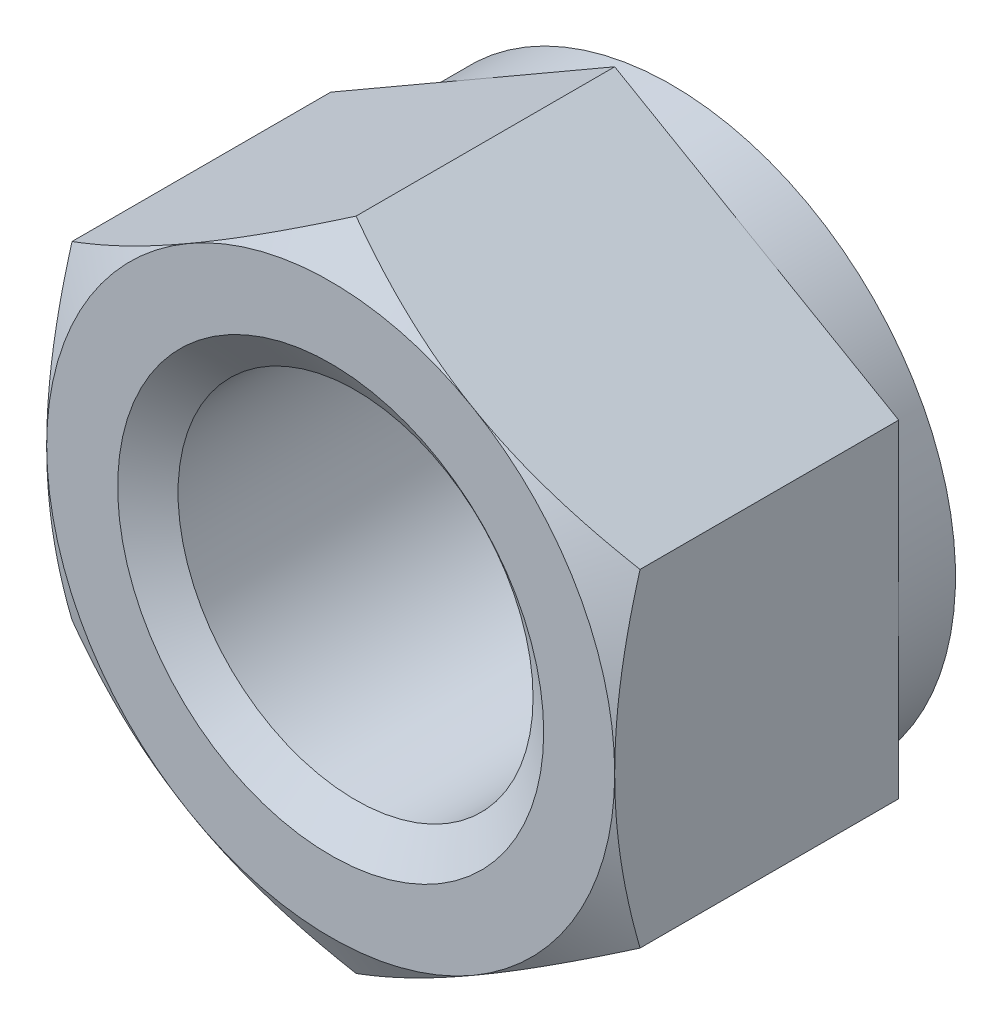
ISO-10303-21;
HEADER;
FILE_DESCRIPTION(('STEP AP214'),'2;1');
FILE_NAME('part.step','',(''),(''),'','','');
FILE_SCHEMA(('AUTOMOTIVE_DESIGN { 1 0 10303 214 1 1 1 1 }'));
ENDSEC;
DATA;
#1=APPLICATION_CONTEXT('core data for automotive mechanical design processes');
#2=APPLICATION_PROTOCOL_DEFINITION('international standard','automotive_design',2000,#1);
#3=PRODUCT_CONTEXT('',#1,'mechanical');
#4=PRODUCT('Part','Part','',(#3));
#5=PRODUCT_RELATED_PRODUCT_CATEGORY('part','',(#4));
#6=PRODUCT_DEFINITION_FORMATION('','',#4);
#7=PRODUCT_DEFINITION_CONTEXT('part definition',#1,'design');
#8=PRODUCT_DEFINITION('design','',#6,#7);
#9=PRODUCT_DEFINITION_SHAPE('','',#8);
#10=(LENGTH_UNIT() NAMED_UNIT(*) SI_UNIT(.MILLI.,.METRE.));
#11=(NAMED_UNIT(*) PLANE_ANGLE_UNIT() SI_UNIT($,.RADIAN.));
#12=(NAMED_UNIT(*) SI_UNIT($,.STERADIAN.) SOLID_ANGLE_UNIT());
#13=UNCERTAINTY_MEASURE_WITH_UNIT(LENGTH_MEASURE(1.E-05),#10,'distance_accuracy_value','');
#14=(GEOMETRIC_REPRESENTATION_CONTEXT(3) GLOBAL_UNCERTAINTY_ASSIGNED_CONTEXT((#13)) GLOBAL_UNIT_ASSIGNED_CONTEXT((#10,
#11,#12)) REPRESENTATION_CONTEXT('',''));
#15=CARTESIAN_POINT('',(0.,0.,0.));
#16=DIRECTION('',(0.,0.,1.));
#17=DIRECTION('',(1.,0.,0.));
#18=AXIS2_PLACEMENT_3D('',#15,#16,#17);
#19=CARTESIAN_POINT('',(0.,0.,-2.4));
#20=DIRECTION('',(0.,0.,1.));
#21=DIRECTION('',(1.,0.,0.));
#22=AXIS2_PLACEMENT_3D('',#19,#20,#21);
#23=CYLINDRICAL_SURFACE('',#22,1.25);
#24=CARTESIAN_POINT('',(0.,0.,-0.17505188455243));
#25=DIRECTION('',(0.,0.,1.));
#26=DIRECTION('',(1.,0.,0.));
#27=AXIS2_PLACEMENT_3D('',#24,#25,#26);
#28=CIRCLE('',#27,1.25);
#29=CARTESIAN_POINT('',(1.25,0.,-0.17505188455243));
#30=VERTEX_POINT('',#29);
#31=EDGE_CURVE('E153',#30,#30,#28,.F.);
#32=ORIENTED_EDGE('',*,*,#31,.F.);
#33=EDGE_LOOP('',(#32));
#34=FACE_BOUND('',#33,.T.);
#35=CARTESIAN_POINT('',(0.,0.,-2.19954811544757));
#36=DIRECTION('',(0.,0.,-1.));
#37=DIRECTION('',(-1.,0.,0.));
#38=AXIS2_PLACEMENT_3D('',#35,#36,#37);
#39=CIRCLE('',#38,1.25);
#40=CARTESIAN_POINT('',(-1.25,0.,-2.19954811544757));
#41=VERTEX_POINT('',#40);
#42=EDGE_CURVE('E41',#41,#41,#39,.F.);
#43=ORIENTED_EDGE('',*,*,#42,.F.);
#44=EDGE_LOOP('',(#43));
#45=FACE_BOUND('',#44,.T.);
#46=ADVANCED_FACE('F36',(#34,#45),#23,.F.);
#47=CARTESIAN_POINT('',(0.,2.30940107675851,-2.4));
#48=DIRECTION('',(-0.500000000000001,0.866025403784438,0.));
#49=DIRECTION('',(-0.866025403784438,-0.500000000000001,0.));
#50=AXIS2_PLACEMENT_3D('',#47,#48,#49);
#51=PLANE('',#50);
#52=DIRECTION('',(0.,0.,1.));
#53=VECTOR('',#52,1.);
#54=CARTESIAN_POINT('',(-2.,1.15470053837925,-2.4));
#55=LINE('',#54,#53);
#56=CARTESIAN_POINT('',(-2.,1.15470053837925,-2.));
#57=VERTEX_POINT('',#56);
#58=CARTESIAN_POINT('',(-2.,1.15470053837925,-0.178632794954083));
#59=VERTEX_POINT('',#58);
#60=EDGE_CURVE('E288',#57,#59,#55,.T.);
#61=ORIENTED_EDGE('',*,*,#60,.T.);
#62=CARTESIAN_POINT('',(-2.0002,1.15458506832541,-0.178699466620498));
#63=CARTESIAN_POINT('',(-1.91230873709994,1.20532911262018,-0.149389536100679));
#64=CARTESIAN_POINT('',(-1.82365880552641,1.2565111744778,-0.122732851980467));
#65=CARTESIAN_POINT('',(-1.6448237530022,1.35976164019319,-0.0762024910207215));
#66=CARTESIAN_POINT('',(-1.55463545349496,1.41183187919145,-0.0563452763827796));
#67=CARTESIAN_POINT('',(-1.37537661423669,1.51532701829183,-0.025433464023253));
#68=CARTESIAN_POINT('',(-1.2863336617737,1.56673599086578,-0.0141731515985316));
#69=CARTESIAN_POINT('',(-1.10782860221496,1.66979593505373,-0.00072866259464233));
#70=CARTESIAN_POINT('',(-1.01836714429604,1.72144653186531,0.00146664504653134));
#71=CARTESIAN_POINT('',(-0.851191646451202,1.81796535054794,-0.00309098933064944));
#72=CARTESIAN_POINT('',(-0.773452629734216,1.86284799277603,-0.00872487468701537));
#73=CARTESIAN_POINT('',(-0.618481085463867,1.95232085557725,-0.0265838952608293));
#74=CARTESIAN_POINT('',(-0.541249094258801,1.99691076648954,-0.0388151360234404));
#75=CARTESIAN_POINT('',(-0.385957813517799,2.08656822922816,-0.069393436867611));
#76=CARTESIAN_POINT('',(-0.30791818689262,2.13162442866767,-0.0878701670657172));
#77=CARTESIAN_POINT('',(-0.153003134307865,2.221064675979,-0.129805518212858));
#78=CARTESIAN_POINT('',(-0.0761257223768793,2.26544987045196,-0.153254280492316));
#79=CARTESIAN_POINT('',(0.000200000000000656,2.30951654681234,-0.1786994666205));
#80=B_SPLINE_CURVE_WITH_KNOTS('',3,(#62,#63,#64,#65,#66,#67,#68,#69,#70,#71,#72,#73,#74,#75,#76,
#77,#78,#79),.UNSPECIFIED.,.F.,.F.,(4,2,2,2,2,2,2,2,4),(0.,0.31703182469561,0.634825876346564,
0.944753967652636,1.25430138000371,1.52387047293094,1.79368946861028,2.06949491027634,
2.34475850821473),.UNSPECIFIED.);
#81=CARTESIAN_POINT('',(-1.,1.73205080756888,0.));
#82=VERTEX_POINT('',#81);
#83=EDGE_CURVE('E60',#59,#82,#80,.T.);
#84=ORIENTED_EDGE('',*,*,#83,.T.);
#85=CARTESIAN_POINT('',(0.,2.30940107675851,-0.178632794954083));
#86=VERTEX_POINT('',#85);
#87=EDGE_CURVE('E167',#82,#86,#80,.T.);
#88=ORIENTED_EDGE('',*,*,#87,.T.);
#89=DIRECTION('',(0.,0.,1.));
#90=VECTOR('',#89,1.);
#91=CARTESIAN_POINT('',(0.,2.30940107675851,-2.4));
#92=LINE('',#91,#90);
#93=CARTESIAN_POINT('',(0.,2.30940107675851,-2.));
#94=VERTEX_POINT('',#93);
#95=EDGE_CURVE('E276',#94,#86,#92,.T.);
#96=ORIENTED_EDGE('',*,*,#95,.F.);
#97=DIRECTION('',(-0.866025403784438,-0.500000000000001,0.));
#98=VECTOR('',#97,1.);
#99=CARTESIAN_POINT('',(0.,2.30940107675851,-2.));
#100=LINE('',#99,#98);
#101=CARTESIAN_POINT('',(-1.,1.73205080756888,-2.));
#102=VERTEX_POINT('',#101);
#103=EDGE_CURVE('E264',#94,#102,#100,.T.);
#104=ORIENTED_EDGE('',*,*,#103,.T.);
#105=EDGE_CURVE('E260',#102,#57,#100,.T.);
#106=ORIENTED_EDGE('',*,*,#105,.T.);
#107=EDGE_LOOP('',(#61,#84,#88,#96,#104,#106));
#108=FACE_BOUND('',#107,.T.);
#109=ADVANCED_FACE('F38',(#108),#51,.T.);
#110=CARTESIAN_POINT('',(2.,1.15470053837925,-2.4));
#111=DIRECTION('',(0.500000000000002,0.866025403784437,0.));
#112=DIRECTION('',(-0.866025403784438,0.500000000000002,0.));
#113=AXIS2_PLACEMENT_3D('',#110,#111,#112);
#114=PLANE('',#113);
#115=ORIENTED_EDGE('',*,*,#95,.T.);
#116=CARTESIAN_POINT('',(-0.000199999999999259,2.30951654681234,-0.1786994666205));
#117=CARTESIAN_POINT('',(0.0876912629000607,2.25877250251758,-0.149389536100681));
#118=CARTESIAN_POINT('',(0.176341194473592,2.20759044065996,-0.122732851980469));
#119=CARTESIAN_POINT('',(0.355176246997803,2.10433997494456,-0.0762024910207225));
#120=CARTESIAN_POINT('',(0.445364546505037,2.05226973594631,-0.0563452763827804));
#121=CARTESIAN_POINT('',(0.624623385763307,1.94877459684592,-0.0254334640232533));
#122=CARTESIAN_POINT('',(0.713666338226305,1.89736562427197,-0.0141731515985317));
#123=CARTESIAN_POINT('',(0.892171397785044,1.79430568008402,-0.000728662594642108));
#124=CARTESIAN_POINT('',(0.981632855703959,1.74265508327244,0.00146664504653167));
#125=CARTESIAN_POINT('',(1.1488083535488,1.64613626458981,-0.00309098933064885));
#126=CARTESIAN_POINT('',(1.22654737026578,1.60125362236172,-0.00872487468701462));
#127=CARTESIAN_POINT('',(1.38151891453613,1.51178075956051,-0.0265838952608285));
#128=CARTESIAN_POINT('',(1.4587509057412,1.46719084864821,-0.0388151360234395));
#129=CARTESIAN_POINT('',(1.6140421864822,1.37753338590959,-0.0693934368676101));
#130=CARTESIAN_POINT('',(1.69208181310738,1.33247718647009,-0.0878701670657161));
#131=CARTESIAN_POINT('',(1.84699686569214,1.24303693915875,-0.129805518212856));
#132=CARTESIAN_POINT('',(1.92387427762312,1.19865174468579,-0.153254280492314));
#133=CARTESIAN_POINT('',(2.0002,1.15458506832541,-0.178699466620498));
#134=B_SPLINE_CURVE_WITH_KNOTS('',3,(#116,#117,#118,#119,#120,#121,#122,#123,#124,#125,#126,
#127,#128,#129,#130,#131,#132,#133),.UNSPECIFIED.,.F.,.F.,(4,2,2,2,2,2,2,2,4),(0.,
0.31703182469561,0.634825876346565,0.944753967652638,1.25430138000371,1.52387047293094,
1.79368946861029,2.06949491027634,2.34475850821473),.UNSPECIFIED.);
#135=CARTESIAN_POINT('',(1.,1.73205080756888,0.));
#136=VERTEX_POINT('',#135);
#137=EDGE_CURVE('E164',#86,#136,#134,.T.);
#138=ORIENTED_EDGE('',*,*,#137,.T.);
#139=CARTESIAN_POINT('',(2.,1.15470053837926,-0.178632794954083));
#140=VERTEX_POINT('',#139);
#141=EDGE_CURVE('E147',#136,#140,#134,.T.);
#142=ORIENTED_EDGE('',*,*,#141,.T.);
#143=DIRECTION('',(0.,0.,1.));
#144=VECTOR('',#143,1.);
#145=CARTESIAN_POINT('',(2.,1.15470053837925,-2.4));
#146=LINE('',#145,#144);
#147=CARTESIAN_POINT('',(2.,1.15470053837925,-2.));
#148=VERTEX_POINT('',#147);
#149=EDGE_CURVE('E163',#148,#140,#146,.T.);
#150=ORIENTED_EDGE('',*,*,#149,.F.);
#151=DIRECTION('',(-0.866025403784438,0.500000000000002,0.));
#152=VECTOR('',#151,1.);
#153=CARTESIAN_POINT('',(2.,1.15470053837925,-2.));
#154=LINE('',#153,#152);
#155=CARTESIAN_POINT('',(1.,1.73205080756888,-2.));
#156=VERTEX_POINT('',#155);
#157=EDGE_CURVE('E272',#148,#156,#154,.T.);
#158=ORIENTED_EDGE('',*,*,#157,.T.);
#159=EDGE_CURVE('E268',#156,#94,#154,.T.);
#160=ORIENTED_EDGE('',*,*,#159,.T.);
#161=EDGE_LOOP('',(#115,#138,#142,#150,#158,#160));
#162=FACE_BOUND('',#161,.T.);
#163=ADVANCED_FACE('F236',(#162),#114,.T.);
#164=CARTESIAN_POINT('',(2.,1.15470053837925,-2.4));
#165=DIRECTION('',(-1.,0.,0.));
#166=DIRECTION('',(0.,0.,1.));
#167=AXIS2_PLACEMENT_3D('',#164,#165,#166);
#168=PLANE('',#167);
#169=CARTESIAN_POINT('',(2.,-3.06243599497946,-0.957053410620321));
#170=CARTESIAN_POINT('',(2.,-2.97462468513202,-0.914618135332452));
#171=CARTESIAN_POINT('',(2.,-2.88660576044575,-0.872604701878199));
#172=CARTESIAN_POINT('',(2.,-2.71004042392047,-0.789662573424089));
#173=CARTESIAN_POINT('',(2.,-2.62149392396103,-0.748734066234633));
#174=CARTESIAN_POINT('',(2.,-2.44328285836994,-0.667987231477972));
#175=CARTESIAN_POINT('',(2.,-2.3536147942302,-0.628176597351501));
#176=CARTESIAN_POINT('',(2.,-2.17354167395292,-0.55026529289016));
#177=CARTESIAN_POINT('',(2.,-2.08313665652235,-0.512164533422732));
#178=CARTESIAN_POINT('',(2.,-1.90031404940485,-0.437671460362099));
#179=CARTESIAN_POINT('',(2.,-1.80788540023434,-0.401306140224328));
#180=CARTESIAN_POINT('',(2.,-1.62195694964761,-0.331431205515075));
#181=CARTESIAN_POINT('',(2.,-1.52845725096658,-0.297921319609402));
#182=CARTESIAN_POINT('',(2.,-1.34040158791134,-0.234645877627144));
#183=CARTESIAN_POINT('',(2.,-1.24584820361334,-0.204872731943686));
#184=CARTESIAN_POINT('',(2.,-1.05539728812543,-0.150041663725098));
#185=CARTESIAN_POINT('',(2.,-0.959500192348565,-0.124982250068513));
#186=CARTESIAN_POINT('',(2.,-0.766296107056177,-0.080795452261452));
#187=CARTESIAN_POINT('',(2.,-0.668988749343054,-0.0616696475902395));
#188=CARTESIAN_POINT('',(2.,-0.473201573751662,-0.030636913349022));
#189=CARTESIAN_POINT('',(2.,-0.374721754836868,-0.0187299901614156));
#190=CARTESIAN_POINT('',(2.,-0.177725213014459,-0.00319166535968532));
#191=CARTESIAN_POINT('',(2.,-0.0792127464695961,0.000492126942978395));
#192=CARTESIAN_POINT('',(2.,0.117733134481543,-0.00059921048284586));
#193=CARTESIAN_POINT('',(2.,0.216166562771042,-0.00537214444611043));
#194=CARTESIAN_POINT('',(2.,0.454297223248123,-0.0267243139120266));
#195=CARTESIAN_POINT('',(2.,0.593620477818537,-0.0474829418890643));
#196=CARTESIAN_POINT('',(2.,0.869689306254771,-0.102199494270679));
#197=CARTESIAN_POINT('',(2.,1.00643164818022,-0.136172948124203));
#198=CARTESIAN_POINT('',(2.,1.21108706615394,-0.194758945655361));
#199=CARTESIAN_POINT('',(2.,1.28004655189501,-0.215857177032566));
#200=CARTESIAN_POINT('',(2.,1.41724192464572,-0.260142084128328));
#201=CARTESIAN_POINT('',(2.,1.48547827495749,-0.283327319381157));
#202=CARTESIAN_POINT('',(2.,1.62094688255353,-0.331302907971969));
#203=CARTESIAN_POINT('',(2.,1.68818262968755,-0.356083492073602));
#204=CARTESIAN_POINT('',(2.,1.82213246587635,-0.407099147686616));
#205=CARTESIAN_POINT('',(2.,1.88884633148565,-0.433334807052327));
#206=CARTESIAN_POINT('',(2.,1.95531849493342,-0.460154503270896));
#207=B_SPLINE_CURVE_WITH_KNOTS('',3,(#169,#170,#171,#172,#173,#174,#175,#176,#177,#178,#179,
#180,#181,#182,#183,#184,#185,#186,#187,#188,#189,#190,#191,#192,#193,#194,#195,#196,#197,#198,
#199,#200,#201,#202,#203,#204,#205,#206),.UNSPECIFIED.,.F.,.F.,(4,2,2,2,2,2,2,2,2,2,2,2,2,2,2,2,
2,2,4),(0.,0.292585896266135,0.585222115299634,0.879532973229948,1.17382847142413,
1.47176772581358,1.76967863724007,2.06697432467463,2.36417580814398,2.66145633652585,
2.95873712774069,3.25411843045681,3.54942304948606,3.97114178181684,4.39335760296179,
4.60967655565109,4.82584733174413,5.04080135347749,5.25584285892499),.UNSPECIFIED.);
#208=CARTESIAN_POINT('',(2.,-1.15470053837926,-0.178632794954083));
#209=VERTEX_POINT('',#208);
#210=CARTESIAN_POINT('',(2.,0.,0.));
#211=VERTEX_POINT('',#210);
#212=EDGE_CURVE('E128',#209,#211,#207,.T.);
#213=ORIENTED_EDGE('',*,*,#212,.F.);
#214=DIRECTION('',(0.,0.,1.));
#215=VECTOR('',#214,1.);
#216=CARTESIAN_POINT('',(2.,-1.15470053837926,-2.4));
#217=LINE('',#216,#215);
#218=CARTESIAN_POINT('',(2.,-1.15470053837926,-2.));
#219=VERTEX_POINT('',#218);
#220=EDGE_CURVE('E281',#219,#209,#217,.T.);
#221=ORIENTED_EDGE('',*,*,#220,.F.);
#222=DIRECTION('',(0.,-1.,0.));
#223=VECTOR('',#222,1.);
#224=CARTESIAN_POINT('',(2.,1.15470053837925,-2.));
#225=LINE('',#224,#223);
#226=CARTESIAN_POINT('',(2.,0.,-2.));
#227=VERTEX_POINT('',#226);
#228=EDGE_CURVE('E273',#227,#219,#225,.T.);
#229=ORIENTED_EDGE('',*,*,#228,.F.);
#230=EDGE_CURVE('E275',#148,#227,#225,.T.);
#231=ORIENTED_EDGE('',*,*,#230,.F.);
#232=ORIENTED_EDGE('',*,*,#149,.T.);
#233=EDGE_CURVE('E141',#211,#140,#207,.T.);
#234=ORIENTED_EDGE('',*,*,#233,.F.);
#235=EDGE_LOOP('',(#213,#221,#229,#231,#232,#234));
#236=FACE_BOUND('',#235,.T.);
#237=ADVANCED_FACE('F160',(#236),#168,.F.);
#238=CARTESIAN_POINT('',(0.,-2.30940107675851,-2.4));
#239=DIRECTION('',(0.500000000000001,-0.866025403784438,0.));
#240=DIRECTION('',(0.866025403784438,0.500000000000001,0.));
#241=AXIS2_PLACEMENT_3D('',#238,#239,#240);
#242=PLANE('',#241);
#243=ORIENTED_EDGE('',*,*,#220,.T.);
#244=CARTESIAN_POINT('',(2.0002,-1.15458506832542,-0.1786994666205));
#245=CARTESIAN_POINT('',(1.91230873709994,-1.20532911262018,-0.149389536100681));
#246=CARTESIAN_POINT('',(1.82365880552641,-1.2565111744778,-0.122732851980469));
#247=CARTESIAN_POINT('',(1.6448237530022,-1.3597616401932,-0.0762024910207233));
#248=CARTESIAN_POINT('',(1.55463545349496,-1.41183187919146,-0.0563452763827815));
#249=CARTESIAN_POINT('',(1.37537661423669,-1.51532701829184,-0.0254334640232552));
#250=CARTESIAN_POINT('',(1.2863336617737,-1.56673599086579,-0.0141731515985339));
#251=CARTESIAN_POINT('',(1.10782860221496,-1.66979593505374,-0.000728662594644789));
#252=CARTESIAN_POINT('',(1.01836714429604,-1.72144653186532,0.00146664504652883));
#253=CARTESIAN_POINT('',(0.851191646451201,-1.81796535054795,-0.00309098933065211));
#254=CARTESIAN_POINT('',(0.773452629734215,-1.86284799277604,-0.00872487468701811));
#255=CARTESIAN_POINT('',(0.618481085463866,-1.95232085557725,-0.0265838952608323));
#256=CARTESIAN_POINT('',(0.541249094258801,-1.99691076648955,-0.0388151360234435));
#257=CARTESIAN_POINT('',(0.385957813517798,-2.08656822922817,-0.0693934368676142));
#258=CARTESIAN_POINT('',(0.30791818689262,-2.13162442866767,-0.0878701670657203));
#259=CARTESIAN_POINT('',(0.153003134307864,-2.22106467597901,-0.12980551821286));
#260=CARTESIAN_POINT('',(0.0761257223768791,-2.26544987045196,-0.153254280492318));
#261=CARTESIAN_POINT('',(-0.000200000000000585,-2.30951654681235,-0.178699466620503));
#262=B_SPLINE_CURVE_WITH_KNOTS('',3,(#244,#245,#246,#247,#248,#249,#250,#251,#252,#253,#254,
#255,#256,#257,#258,#259,#260,#261),.UNSPECIFIED.,.F.,.F.,(4,2,2,2,2,2,2,2,4),(0.,
0.31703182469561,0.634825876346564,0.944753967652637,1.25430138000371,1.52387047293094,
1.79368946861028,2.06949491027634,2.34475850821473),.UNSPECIFIED.);
#263=CARTESIAN_POINT('',(1.,-1.73205080756888,0.));
#264=VERTEX_POINT('',#263);
#265=EDGE_CURVE('E135',#209,#264,#262,.T.);
#266=ORIENTED_EDGE('',*,*,#265,.T.);
#267=CARTESIAN_POINT('',(0.,-2.30940107675851,-0.178632794954083));
#268=VERTEX_POINT('',#267);
#269=EDGE_CURVE('E174',#264,#268,#262,.T.);
#270=ORIENTED_EDGE('',*,*,#269,.T.);
#271=DIRECTION('',(0.,0.,1.));
#272=VECTOR('',#271,1.);
#273=CARTESIAN_POINT('',(0.,-2.30940107675851,-2.4));
#274=LINE('',#273,#272);
#275=CARTESIAN_POINT('',(0.,-2.30940107675851,-2.));
#276=VERTEX_POINT('',#275);
#277=EDGE_CURVE('E283',#276,#268,#274,.T.);
#278=ORIENTED_EDGE('',*,*,#277,.F.);
#279=DIRECTION('',(0.866025403784438,0.500000000000001,0.));
#280=VECTOR('',#279,1.);
#281=CARTESIAN_POINT('',(0.,-2.30940107675851,-2.));
#282=LINE('',#281,#280);
#283=CARTESIAN_POINT('',(1.,-1.73205080756888,-2.));
#284=VERTEX_POINT('',#283);
#285=EDGE_CURVE('E265',#276,#284,#282,.T.);
#286=ORIENTED_EDGE('',*,*,#285,.T.);
#287=EDGE_CURVE('E269',#284,#219,#282,.T.);
#288=ORIENTED_EDGE('',*,*,#287,.T.);
#289=EDGE_LOOP('',(#243,#266,#270,#278,#286,#288));
#290=FACE_BOUND('',#289,.T.);
#291=ADVANCED_FACE('F217',(#290),#242,.T.);
#292=CARTESIAN_POINT('',(-2.,-1.15470053837925,-2.4));
#293=DIRECTION('',(-0.500000000000001,-0.866025403784438,0.));
#294=DIRECTION('',(0.866025403784438,-0.500000000000002,0.));
#295=AXIS2_PLACEMENT_3D('',#292,#293,#294);
#296=PLANE('',#295);
#297=ORIENTED_EDGE('',*,*,#277,.T.);
#298=CARTESIAN_POINT('',(0.000199999999999374,-2.30951654681235,-0.178699466620503));
#299=CARTESIAN_POINT('',(-0.0876912629000609,-2.25877250251758,-0.149389536100683));
#300=CARTESIAN_POINT('',(-0.176341194473593,-2.20759044065996,-0.122732851980471));
#301=CARTESIAN_POINT('',(-0.355176246997804,-2.10433997494457,-0.0762024910207249));
#302=CARTESIAN_POINT('',(-0.445364546505038,-2.05226973594631,-0.0563452763827827));
#303=CARTESIAN_POINT('',(-0.624623385763308,-1.94877459684593,-0.0254334640232557));
#304=CARTESIAN_POINT('',(-0.713666338226306,-1.89736562427198,-0.0141731515985342));
#305=CARTESIAN_POINT('',(-0.892171397785046,-1.79430568008403,-0.000728662594644641));
#306=CARTESIAN_POINT('',(-0.981632855703961,-1.74265508327245,0.00146664504652913));
#307=CARTESIAN_POINT('',(-1.1488083535488,-1.64613626458982,-0.00309098933065138));
#308=CARTESIAN_POINT('',(-1.22654737026579,-1.60125362236173,-0.00872487468701711));
#309=CARTESIAN_POINT('',(-1.38151891453614,-1.51178075956051,-0.0265838952608308));
#310=CARTESIAN_POINT('',(-1.4587509057412,-1.46719084864821,-0.0388151360234417));
#311=CARTESIAN_POINT('',(-1.6140421864822,-1.37753338590959,-0.069393436867612));
#312=CARTESIAN_POINT('',(-1.69208181310738,-1.33247718647009,-0.087870167065718));
#313=CARTESIAN_POINT('',(-1.84699686569214,-1.24303693915876,-0.129805518212858));
#314=CARTESIAN_POINT('',(-1.92387427762312,-1.1986517446858,-0.153254280492315));
#315=CARTESIAN_POINT('',(-2.0002,-1.15458506832542,-0.178699466620499));
#316=B_SPLINE_CURVE_WITH_KNOTS('',3,(#298,#299,#300,#301,#302,#303,#304,#305,#306,#307,#308,
#309,#310,#311,#312,#313,#314,#315),.UNSPECIFIED.,.F.,.F.,(4,2,2,2,2,2,2,2,4),(0.,
0.317031824695611,0.634825876346566,0.944753967652639,1.25430138000372,1.52387047293094,
1.79368946861029,2.06949491027634,2.34475850821473),.UNSPECIFIED.);
#317=CARTESIAN_POINT('',(-1.,-1.73205080756888,0.));
#318=VERTEX_POINT('',#317);
#319=EDGE_CURVE('E211',#268,#318,#316,.T.);
#320=ORIENTED_EDGE('',*,*,#319,.T.);
#321=CARTESIAN_POINT('',(-2.,-1.15470053837926,-0.178632794954083));
#322=VERTEX_POINT('',#321);
#323=EDGE_CURVE('E204',#318,#322,#316,.T.);
#324=ORIENTED_EDGE('',*,*,#323,.T.);
#325=DIRECTION('',(0.,0.,1.));
#326=VECTOR('',#325,1.);
#327=CARTESIAN_POINT('',(-2.,-1.15470053837925,-2.4));
#328=LINE('',#327,#326);
#329=CARTESIAN_POINT('',(-2.,-1.15470053837925,-2.));
#330=VERTEX_POINT('',#329);
#331=EDGE_CURVE('E286',#330,#322,#328,.T.);
#332=ORIENTED_EDGE('',*,*,#331,.F.);
#333=DIRECTION('',(0.866025403784438,-0.500000000000002,0.));
#334=VECTOR('',#333,1.);
#335=CARTESIAN_POINT('',(-2.,-1.15470053837925,-2.));
#336=LINE('',#335,#334);
#337=CARTESIAN_POINT('',(-1.00000000000001,-1.73205080756888,-2.));
#338=VERTEX_POINT('',#337);
#339=EDGE_CURVE('E255',#330,#338,#336,.T.);
#340=ORIENTED_EDGE('',*,*,#339,.T.);
#341=EDGE_CURVE('E261',#338,#276,#336,.T.);
#342=ORIENTED_EDGE('',*,*,#341,.T.);
#343=EDGE_LOOP('',(#297,#320,#324,#332,#340,#342));
#344=FACE_BOUND('',#343,.T.);
#345=ADVANCED_FACE('F213',(#344),#296,.T.);
#346=CARTESIAN_POINT('',(-2.,1.15470053837925,-2.4));
#347=DIRECTION('',(-1.,0.,0.));
#348=DIRECTION('',(0.,0.,1.));
#349=AXIS2_PLACEMENT_3D('',#346,#347,#348);
#350=PLANE('',#349);
#351=ORIENTED_EDGE('',*,*,#331,.T.);
#352=CARTESIAN_POINT('',(-2.,-3.06243599497946,-0.95705341062032));
#353=CARTESIAN_POINT('',(-2.,-2.97462468513202,-0.914618135332451));
#354=CARTESIAN_POINT('',(-2.,-2.88660576044575,-0.872604701878197));
#355=CARTESIAN_POINT('',(-2.,-2.71004042392046,-0.789662573424087));
#356=CARTESIAN_POINT('',(-2.,-2.62149392396102,-0.748734066234631));
#357=CARTESIAN_POINT('',(-2.,-2.44328285836993,-0.66798723147797));
#358=CARTESIAN_POINT('',(-2.,-2.3536147942302,-0.628176597351499));
#359=CARTESIAN_POINT('',(-2.,-2.17354167395292,-0.550265292890159));
#360=CARTESIAN_POINT('',(-2.,-2.08313665652235,-0.51216453342273));
#361=CARTESIAN_POINT('',(-2.,-1.90031404940485,-0.437671460362098));
#362=CARTESIAN_POINT('',(-2.,-1.80788540023433,-0.401306140224327));
#363=CARTESIAN_POINT('',(-2.,-1.62195694964761,-0.331431205515074));
#364=CARTESIAN_POINT('',(-2.,-1.52845725096658,-0.297921319609401));
#365=CARTESIAN_POINT('',(-2.,-1.34040158791134,-0.234645877627143));
#366=CARTESIAN_POINT('',(-2.,-1.24584820361334,-0.204872731943685));
#367=CARTESIAN_POINT('',(-2.,-1.05539728812543,-0.150041663725097));
#368=CARTESIAN_POINT('',(-2.,-0.959500192348563,-0.124982250068512));
#369=CARTESIAN_POINT('',(-2.,-0.766296107056175,-0.0807954522614516));
#370=CARTESIAN_POINT('',(-2.,-0.668988749343052,-0.0616696475902392));
#371=CARTESIAN_POINT('',(-2.,-0.47320157375166,-0.0306369133490218));
#372=CARTESIAN_POINT('',(-2.,-0.374721754836867,-0.0187299901614153));
#373=CARTESIAN_POINT('',(-2.,-0.177725213014457,-0.00319166535968511));
#374=CARTESIAN_POINT('',(-2.,-0.0792127464695944,0.000492126942978438));
#375=CARTESIAN_POINT('',(-2.,0.117733134481545,-0.000599210482845904));
#376=CARTESIAN_POINT('',(-2.,0.216166562771044,-0.0053721444461104));
#377=CARTESIAN_POINT('',(-2.,0.454297223248125,-0.0267243139120267));
#378=CARTESIAN_POINT('',(-2.,0.59362047781854,-0.0474829418890648));
#379=CARTESIAN_POINT('',(-2.,0.869689306254774,-0.10219949427068));
#380=CARTESIAN_POINT('',(-2.,1.00643164818022,-0.136172948124205));
#381=CARTESIAN_POINT('',(-2.,1.21108706615395,-0.194758945655363));
#382=CARTESIAN_POINT('',(-2.,1.28004655189502,-0.215857177032567));
#383=CARTESIAN_POINT('',(-2.,1.41724192464572,-0.260142084128329));
#384=CARTESIAN_POINT('',(-2.,1.48547827495749,-0.283327319381159));
#385=CARTESIAN_POINT('',(-2.,1.62094688255354,-0.331302907971971));
#386=CARTESIAN_POINT('',(-2.,1.68818262968755,-0.356083492073603));
#387=CARTESIAN_POINT('',(-2.,1.82213246587635,-0.407099147686617));
#388=CARTESIAN_POINT('',(-2.,1.88884633148566,-0.433334807052329));
#389=CARTESIAN_POINT('',(-2.,1.95531849493342,-0.460154503270898));
#390=B_SPLINE_CURVE_WITH_KNOTS('',3,(#352,#353,#354,#355,#356,#357,#358,#359,#360,#361,#362,
#363,#364,#365,#366,#367,#368,#369,#370,#371,#372,#373,#374,#375,#376,#377,#378,#379,#380,#381,
#382,#383,#384,#385,#386,#387,#388,#389),.UNSPECIFIED.,.F.,.F.,(4,2,2,2,2,2,2,2,2,2,2,2,2,2,2,2,
2,2,4),(0.,0.292585896266136,0.585222115299635,0.879532973229949,1.17382847142413,
1.47176772581358,1.76967863724007,2.06697432467463,2.36417580814398,2.66145633652585,
2.95873712774069,3.25411843045681,3.54942304948606,3.97114178181684,4.39335760296179,
4.60967655565109,4.82584733174413,5.0408013534775,5.25584285892499),.UNSPECIFIED.);
#391=CARTESIAN_POINT('',(-2.,0.,0.));
#392=VERTEX_POINT('',#391);
#393=EDGE_CURVE('E212',#322,#392,#390,.T.);
#394=ORIENTED_EDGE('',*,*,#393,.T.);
#395=EDGE_CURVE('E152',#392,#59,#390,.T.);
#396=ORIENTED_EDGE('',*,*,#395,.T.);
#397=ORIENTED_EDGE('',*,*,#60,.F.);
#398=DIRECTION('',(0.,-1.,0.));
#399=VECTOR('',#398,1.);
#400=CARTESIAN_POINT('',(-2.,1.15470053837925,-2.));
#401=LINE('',#400,#399);
#402=CARTESIAN_POINT('',(-2.,0.,-2.));
#403=VERTEX_POINT('',#402);
#404=EDGE_CURVE('E295',#57,#403,#401,.T.);
#405=ORIENTED_EDGE('',*,*,#404,.T.);
#406=EDGE_CURVE('E293',#403,#330,#401,.T.);
#407=ORIENTED_EDGE('',*,*,#406,.T.);
#408=EDGE_LOOP('',(#351,#394,#396,#397,#405,#407));
#409=FACE_BOUND('',#408,.T.);
#410=ADVANCED_FACE('F216',(#409),#350,.T.);
#411=CARTESIAN_POINT('',(0.,2.30940107675851,0.));
#412=DIRECTION('',(0.,0.,-1.));
#413=DIRECTION('',(-1.,0.,0.));
#414=AXIS2_PLACEMENT_3D('',#411,#412,#413);
#415=PLANE('',#414);
#416=CARTESIAN_POINT('',(0.,0.,0.));
#417=DIRECTION('',(0.,0.,1.));
#418=DIRECTION('',(1.,0.,0.));
#419=AXIS2_PLACEMENT_3D('',#416,#417,#418);
#420=CIRCLE('',#419,1.5);
#421=CARTESIAN_POINT('',(1.5,0.,0.));
#422=VERTEX_POINT('',#421);
#423=EDGE_CURVE('E298',#422,#422,#420,.T.);
#424=ORIENTED_EDGE('',*,*,#423,.F.);
#425=EDGE_LOOP('',(#424));
#426=FACE_BOUND('',#425,.T.);
#427=CARTESIAN_POINT('',(0.,0.,0.));
#428=DIRECTION('',(0.,0.,-1.));
#429=DIRECTION('',(-1.,0.,0.));
#430=AXIS2_PLACEMENT_3D('',#427,#428,#429);
#431=CIRCLE('',#430,2.);
#432=EDGE_CURVE('E48',#82,#392,#431,.F.);
#433=ORIENTED_EDGE('',*,*,#432,.T.);
#434=EDGE_CURVE('E12',#392,#318,#431,.F.);
#435=ORIENTED_EDGE('',*,*,#434,.T.);
#436=EDGE_CURVE('E46',#318,#264,#431,.F.);
#437=ORIENTED_EDGE('',*,*,#436,.T.);
#438=EDGE_CURVE('E132',#264,#211,#431,.F.);
#439=ORIENTED_EDGE('',*,*,#438,.T.);
#440=CARTESIAN_POINT('',(0.,0.,0.));
#441=DIRECTION('',(0.,0.,1.));
#442=DIRECTION('',(1.,0.,0.));
#443=AXIS2_PLACEMENT_3D('',#440,#441,#442);
#444=CIRCLE('',#443,2.);
#445=EDGE_CURVE('E144',#211,#136,#444,.T.);
#446=ORIENTED_EDGE('',*,*,#445,.T.);
#447=EDGE_CURVE('E158',#136,#82,#431,.F.);
#448=ORIENTED_EDGE('',*,*,#447,.T.);
#449=EDGE_LOOP('',(#433,#435,#437,#439,#446,#448));
#450=FACE_BOUND('',#449,.T.);
#451=ADVANCED_FACE('F156',(#426,#450),#415,.F.);
#452=CARTESIAN_POINT('',(0.,2.30940107675851,-2.4));
#453=DIRECTION('',(0.,0.,-1.));
#454=DIRECTION('',(-1.,0.,0.));
#455=AXIS2_PLACEMENT_3D('',#452,#453,#454);
#456=PLANE('',#455);
#457=CARTESIAN_POINT('',(0.,0.,-2.4));
#458=DIRECTION('',(0.,0.,-1.));
#459=DIRECTION('',(-1.,0.,0.));
#460=AXIS2_PLACEMENT_3D('',#457,#458,#459);
#461=CIRCLE('',#460,1.5);
#462=CARTESIAN_POINT('',(-1.5,0.,-2.4));
#463=VERTEX_POINT('',#462);
#464=EDGE_CURVE('E299',#463,#463,#461,.F.);
#465=ORIENTED_EDGE('',*,*,#464,.T.);
#466=EDGE_LOOP('',(#465));
#467=FACE_BOUND('',#466,.T.);
#468=CARTESIAN_POINT('',(0.,0.,-2.4));
#469=DIRECTION('',(0.,0.,-1.));
#470=DIRECTION('',(-1.,0.,0.));
#471=AXIS2_PLACEMENT_3D('',#468,#469,#470);
#472=CIRCLE('',#471,2.);
#473=CARTESIAN_POINT('',(-2.,0.,-2.4));
#474=VERTEX_POINT('',#473);
#475=EDGE_CURVE('E279',#474,#474,#472,.F.);
#476=ORIENTED_EDGE('',*,*,#475,.F.);
#477=EDGE_LOOP('',(#476));
#478=FACE_BOUND('',#477,.T.);
#479=ADVANCED_FACE('F226',(#467,#478),#456,.T.);
#480=CARTESIAN_POINT('',(0.,12.3094010767585,-2.));
#481=DIRECTION('',(0.,0.,-1.));
#482=DIRECTION('',(-1.,0.,0.));
#483=AXIS2_PLACEMENT_3D('',#480,#481,#482);
#484=PLANE('',#483);
#485=ORIENTED_EDGE('',*,*,#230,.T.);
#486=CARTESIAN_POINT('',(0.,0.,-2.));
#487=DIRECTION('',(0.,0.,1.));
#488=DIRECTION('',(1.,0.,0.));
#489=AXIS2_PLACEMENT_3D('',#486,#487,#488);
#490=CIRCLE('',#489,2.);
#491=EDGE_CURVE('E252',#227,#156,#490,.T.);
#492=ORIENTED_EDGE('',*,*,#491,.T.);
#493=ORIENTED_EDGE('',*,*,#157,.F.);
#494=EDGE_LOOP('',(#485,#492,#493));
#495=FACE_BOUND('',#494,.T.);
#496=ADVANCED_FACE('F243',(#495),#484,.T.);
#497=ORIENTED_EDGE('',*,*,#228,.T.);
#498=ORIENTED_EDGE('',*,*,#287,.F.);
#499=EDGE_CURVE('E257',#284,#227,#490,.T.);
#500=ORIENTED_EDGE('',*,*,#499,.T.);
#501=EDGE_LOOP('',(#497,#498,#500));
#502=FACE_BOUND('',#501,.T.);
#503=ADVANCED_FACE('F445',(#502),#484,.T.);
#504=EDGE_CURVE('E256',#156,#102,#490,.T.);
#505=ORIENTED_EDGE('',*,*,#504,.T.);
#506=ORIENTED_EDGE('',*,*,#103,.F.);
#507=ORIENTED_EDGE('',*,*,#159,.F.);
#508=EDGE_LOOP('',(#505,#506,#507));
#509=FACE_BOUND('',#508,.T.);
#510=ADVANCED_FACE('F436',(#509),#484,.T.);
#511=ORIENTED_EDGE('',*,*,#341,.F.);
#512=EDGE_CURVE('E509',#338,#284,#490,.T.);
#513=ORIENTED_EDGE('',*,*,#512,.T.);
#514=ORIENTED_EDGE('',*,*,#285,.F.);
#515=EDGE_LOOP('',(#511,#513,#514));
#516=FACE_BOUND('',#515,.T.);
#517=ADVANCED_FACE('F427',(#516),#484,.T.);
#518=EDGE_CURVE('E523',#102,#403,#490,.T.);
#519=ORIENTED_EDGE('',*,*,#518,.T.);
#520=ORIENTED_EDGE('',*,*,#404,.F.);
#521=ORIENTED_EDGE('',*,*,#105,.F.);
#522=EDGE_LOOP('',(#519,#520,#521));
#523=FACE_BOUND('',#522,.T.);
#524=ADVANCED_FACE('F411',(#523),#484,.T.);
#525=CARTESIAN_POINT('',(0.,0.,0.));
#526=DIRECTION('',(0.,0.,1.));
#527=DIRECTION('',(1.,0.,0.));
#528=AXIS2_PLACEMENT_3D('',#525,#526,#527);
#529=CYLINDRICAL_SURFACE('',#528,2.);
#530=ORIENTED_EDGE('',*,*,#475,.T.);
#531=EDGE_LOOP('',(#530));
#532=FACE_BOUND('',#531,.T.);
#533=ORIENTED_EDGE('',*,*,#504,.F.);
#534=ORIENTED_EDGE('',*,*,#491,.F.);
#535=ORIENTED_EDGE('',*,*,#499,.F.);
#536=ORIENTED_EDGE('',*,*,#512,.F.);
#537=EDGE_CURVE('E525',#403,#338,#490,.T.);
#538=ORIENTED_EDGE('',*,*,#537,.F.);
#539=ORIENTED_EDGE('',*,*,#518,.F.);
#540=EDGE_LOOP('',(#533,#534,#535,#536,#538,#539));
#541=FACE_BOUND('',#540,.T.);
#542=ADVANCED_FACE('F241',(#532,#541),#529,.T.);
#543=ORIENTED_EDGE('',*,*,#406,.F.);
#544=ORIENTED_EDGE('',*,*,#537,.T.);
#545=ORIENTED_EDGE('',*,*,#339,.F.);
#546=EDGE_LOOP('',(#543,#544,#545));
#547=FACE_BOUND('',#546,.T.);
#548=ADVANCED_FACE('F194',(#547),#484,.T.);
#549=CARTESIAN_POINT('',(0.,0.,0.));
#550=DIRECTION('',(0.,0.,-1.));
#551=DIRECTION('',(-1.,0.,0.));
#552=AXIS2_PLACEMENT_3D('',#549,#550,#551);
#553=CONICAL_SURFACE('',#552,2.,1.0471975511966);
#554=ORIENTED_EDGE('',*,*,#395,.F.);
#555=ORIENTED_EDGE('',*,*,#432,.F.);
#556=ORIENTED_EDGE('',*,*,#83,.F.);
#557=EDGE_LOOP('',(#554,#555,#556));
#558=FACE_BOUND('',#557,.T.);
#559=ADVANCED_FACE('F373',(#558),#553,.T.);
#560=ORIENTED_EDGE('',*,*,#447,.F.);
#561=ORIENTED_EDGE('',*,*,#137,.F.);
#562=ORIENTED_EDGE('',*,*,#87,.F.);
#563=EDGE_LOOP('',(#560,#561,#562));
#564=FACE_BOUND('',#563,.T.);
#565=ADVANCED_FACE('F192',(#564),#553,.T.);
#566=ORIENTED_EDGE('',*,*,#445,.F.);
#567=ORIENTED_EDGE('',*,*,#233,.T.);
#568=ORIENTED_EDGE('',*,*,#141,.F.);
#569=EDGE_LOOP('',(#566,#567,#568));
#570=FACE_BOUND('',#569,.T.);
#571=ADVANCED_FACE('F145',(#570),#553,.T.);
#572=ORIENTED_EDGE('',*,*,#212,.T.);
#573=ORIENTED_EDGE('',*,*,#438,.F.);
#574=ORIENTED_EDGE('',*,*,#265,.F.);
#575=EDGE_LOOP('',(#572,#573,#574));
#576=FACE_BOUND('',#575,.T.);
#577=ADVANCED_FACE('F130',(#576),#553,.T.);
#578=ORIENTED_EDGE('',*,*,#436,.F.);
#579=ORIENTED_EDGE('',*,*,#319,.F.);
#580=ORIENTED_EDGE('',*,*,#269,.F.);
#581=EDGE_LOOP('',(#578,#579,#580));
#582=FACE_BOUND('',#581,.T.);
#583=ADVANCED_FACE('F191',(#582),#553,.T.);
#584=ORIENTED_EDGE('',*,*,#434,.F.);
#585=ORIENTED_EDGE('',*,*,#393,.F.);
#586=ORIENTED_EDGE('',*,*,#323,.F.);
#587=EDGE_LOOP('',(#584,#585,#586));
#588=FACE_BOUND('',#587,.T.);
#589=ADVANCED_FACE('F185',(#588),#553,.T.);
#590=CARTESIAN_POINT('',(0.,0.,-0.192557073007672));
#591=DIRECTION('',(0.,0.,1.));
#592=DIRECTION('',(1.,0.,0.));
#593=AXIS2_PLACEMENT_3D('',#590,#591,#592);
#594=CONICAL_SURFACE('',#593,1.225,0.959931088596876);
#595=ORIENTED_EDGE('',*,*,#423,.T.);
#596=EDGE_LOOP('',(#595));
#597=FACE_BOUND('',#596,.T.);
#598=ORIENTED_EDGE('',*,*,#31,.T.);
#599=EDGE_LOOP('',(#598));
#600=FACE_BOUND('',#599,.T.);
#601=ADVANCED_FACE('F190',(#597,#600),#594,.F.);
#602=CARTESIAN_POINT('',(0.,0.,-2.3746));
#603=DIRECTION('',(0.,0.,-1.));
#604=DIRECTION('',(-1.,0.,0.));
#605=AXIS2_PLACEMENT_3D('',#602,#603,#604);
#606=CONICAL_SURFACE('',#605,1.5,0.959931088596876);
#607=CARTESIAN_POINT('',(0.,0.,-2.3746));
#608=DIRECTION('',(0.,0.,1.));
#609=DIRECTION('',(1.,0.,0.));
#610=AXIS2_PLACEMENT_3D('',#607,#608,#609);
#611=CIRCLE('',#610,1.5);
#612=CARTESIAN_POINT('',(1.5,0.,-2.3746));
#613=VERTEX_POINT('',#612);
#614=EDGE_CURVE('E301',#613,#613,#611,.T.);
#615=ORIENTED_EDGE('',*,*,#614,.F.);
#616=EDGE_LOOP('',(#615));
#617=FACE_BOUND('',#616,.T.);
#618=ORIENTED_EDGE('',*,*,#42,.T.);
#619=EDGE_LOOP('',(#618));
#620=FACE_BOUND('',#619,.T.);
#621=ADVANCED_FACE('F314',(#617,#620),#606,.F.);
#622=CARTESIAN_POINT('',(0.,0.,-25.0375057290932));
#623=DIRECTION('',(0.,0.,1.));
#624=DIRECTION('',(1.,0.,0.));
#625=AXIS2_PLACEMENT_3D('',#622,#623,#624);
#626=CYLINDRICAL_SURFACE('',#625,1.5);
#627=ORIENTED_EDGE('',*,*,#464,.F.);
#628=EDGE_LOOP('',(#627));
#629=FACE_BOUND('',#628,.T.);
#630=ORIENTED_EDGE('',*,*,#614,.T.);
#631=EDGE_LOOP('',(#630));
#632=FACE_BOUND('',#631,.T.);
#633=ADVANCED_FACE('F318',(#629,#632),#626,.F.);
#634=CLOSED_SHELL('',(#46,#109,#163,#237,#291,#345,#410,#451,#479,#496,#503,#510,#517,#524,#542,
#548,#559,#565,#571,#577,#583,#589,#601,#621,#633));
#635=MANIFOLD_SOLID_BREP('B2',#634);
#636=ADVANCED_BREP_SHAPE_REPRESENTATION('',(#18,#635),#14);
#637=SHAPE_DEFINITION_REPRESENTATION(#9,#636);
ENDSEC;
END-ISO-10303-21;
